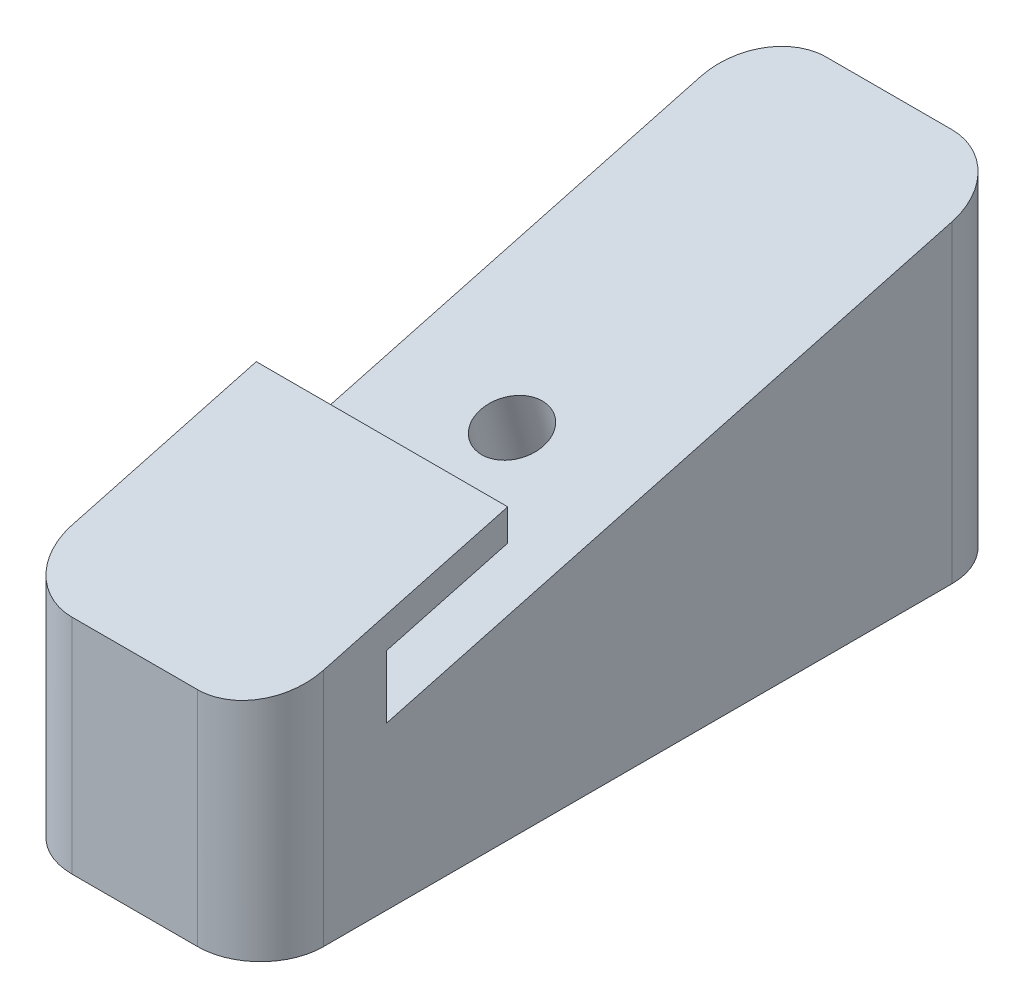
ISO-10303-21;
HEADER;
FILE_DESCRIPTION(('STEP AP214'),'2;1');
FILE_NAME('part.step','',(''),(''),'','','');
FILE_SCHEMA(('AUTOMOTIVE_DESIGN { 1 0 10303 214 1 1 1 1 }'));
ENDSEC;
DATA;
#1=APPLICATION_CONTEXT('core data for automotive mechanical design processes');
#2=APPLICATION_PROTOCOL_DEFINITION('international standard','automotive_design',2000,#1);
#3=PRODUCT_CONTEXT('',#1,'mechanical');
#4=PRODUCT('Part','Part','',(#3));
#5=PRODUCT_RELATED_PRODUCT_CATEGORY('part','',(#4));
#6=PRODUCT_DEFINITION_FORMATION('','',#4);
#7=PRODUCT_DEFINITION_CONTEXT('part definition',#1,'design');
#8=PRODUCT_DEFINITION('design','',#6,#7);
#9=PRODUCT_DEFINITION_SHAPE('','',#8);
#10=(LENGTH_UNIT() NAMED_UNIT(*) SI_UNIT(.MILLI.,.METRE.));
#11=(NAMED_UNIT(*) PLANE_ANGLE_UNIT() SI_UNIT($,.RADIAN.));
#12=(NAMED_UNIT(*) SI_UNIT($,.STERADIAN.) SOLID_ANGLE_UNIT());
#13=UNCERTAINTY_MEASURE_WITH_UNIT(LENGTH_MEASURE(1.E-05),#10,'distance_accuracy_value','');
#14=(GEOMETRIC_REPRESENTATION_CONTEXT(3) GLOBAL_UNCERTAINTY_ASSIGNED_CONTEXT((#13)) GLOBAL_UNIT_ASSIGNED_CONTEXT((#10,
#11,#12)) REPRESENTATION_CONTEXT('',''));
#15=CARTESIAN_POINT('',(0.,0.,0.));
#16=DIRECTION('',(0.,0.,1.));
#17=DIRECTION('',(1.,0.,0.));
#18=AXIS2_PLACEMENT_3D('',#15,#16,#17);
#19=CARTESIAN_POINT('',(-12.7,25.8858262806237,25.4));
#20=DIRECTION('',(0.,0.,-1.));
#21=DIRECTION('',(-1.,0.,0.));
#22=AXIS2_PLACEMENT_3D('',#19,#20,#21);
#23=PLANE('',#22);
#24=DIRECTION('',(0.,-1.,0.));
#25=VECTOR('',#24,1.);
#26=CARTESIAN_POINT('',(-12.7,25.8858262806237,25.4));
#27=LINE('',#26,#25);
#28=CARTESIAN_POINT('',(-12.7,22.7108262806237,25.4));
#29=VERTEX_POINT('',#28);
#30=CARTESIAN_POINT('',(-12.7,16.3608262806237,25.4));
#31=VERTEX_POINT('',#30);
#32=EDGE_CURVE('E162',#29,#31,#27,.T.);
#33=ORIENTED_EDGE('',*,*,#32,.F.);
#34=DIRECTION('',(-1.,0.,0.));
#35=VECTOR('',#34,1.);
#36=CARTESIAN_POINT('',(12.7,22.7108262806237,25.4));
#37=LINE('',#36,#35);
#38=CARTESIAN_POINT('',(12.7,22.7108262806237,25.4));
#39=VERTEX_POINT('',#38);
#40=EDGE_CURVE('E143',#39,#29,#37,.T.);
#41=ORIENTED_EDGE('',*,*,#40,.F.);
#42=DIRECTION('',(0.,-1.,0.));
#43=VECTOR('',#42,1.);
#44=CARTESIAN_POINT('',(12.7,25.8858262806237,25.4));
#45=LINE('',#44,#43);
#46=CARTESIAN_POINT('',(12.7,16.3608262806237,25.4));
#47=VERTEX_POINT('',#46);
#48=EDGE_CURVE('E149',#39,#47,#45,.T.);
#49=ORIENTED_EDGE('',*,*,#48,.T.);
#50=DIRECTION('',(1.,0.,0.));
#51=VECTOR('',#50,1.);
#52=CARTESIAN_POINT('',(-12.7,16.3608262806237,25.4));
#53=LINE('',#52,#51);
#54=EDGE_CURVE('E150',#31,#47,#53,.T.);
#55=ORIENTED_EDGE('',*,*,#54,.F.);
#56=EDGE_LOOP('',(#33,#41,#49,#55));
#57=FACE_BOUND('',#56,.T.);
#58=ADVANCED_FACE('F33',(#57),#23,.T.);
#59=CARTESIAN_POINT('',(0.,33.3756,38.1));
#60=DIRECTION('',(0.,0.,-1.));
#61=DIRECTION('',(-1.,0.,0.));
#62=AXIS2_PLACEMENT_3D('',#59,#60,#61);
#63=PLANE('',#62);
#64=DIRECTION('',(1.,0.,0.));
#65=VECTOR('',#64,1.);
#66=CARTESIAN_POINT('',(-12.7,22.4828715367484,38.1));
#67=LINE('',#66,#65);
#68=CARTESIAN_POINT('',(-6.35,22.4828715367484,38.1));
#69=VERTEX_POINT('',#68);
#70=CARTESIAN_POINT('',(6.35,22.4828715367484,38.1));
#71=VERTEX_POINT('',#70);
#72=EDGE_CURVE('E161',#69,#71,#67,.T.);
#73=ORIENTED_EDGE('',*,*,#72,.F.);
#74=DIRECTION('',(0.,-1.,0.));
#75=VECTOR('',#74,1.);
#76=CARTESIAN_POINT('',(-6.35,0.,38.1));
#77=LINE('',#76,#75);
#78=CARTESIAN_POINT('',(-6.35,0.,38.1));
#79=VERTEX_POINT('',#78);
#80=EDGE_CURVE('E190',#69,#79,#77,.T.);
#81=ORIENTED_EDGE('',*,*,#80,.T.);
#82=DIRECTION('',(1.,0.,0.));
#83=VECTOR('',#82,1.);
#84=CARTESIAN_POINT('',(0.,0.,38.1));
#85=LINE('',#84,#83);
#86=CARTESIAN_POINT('',(6.35,0.,38.1));
#87=VERTEX_POINT('',#86);
#88=EDGE_CURVE('E178',#79,#87,#85,.T.);
#89=ORIENTED_EDGE('',*,*,#88,.T.);
#90=DIRECTION('',(0.,-1.,0.));
#91=VECTOR('',#90,1.);
#92=CARTESIAN_POINT('',(6.35,33.3756,38.1));
#93=LINE('',#92,#91);
#94=EDGE_CURVE('E56',#87,#71,#93,.F.);
#95=ORIENTED_EDGE('',*,*,#94,.T.);
#96=EDGE_LOOP('',(#73,#81,#89,#95));
#97=FACE_BOUND('',#96,.T.);
#98=ADVANCED_FACE('F244',(#97),#63,.F.);
#99=CARTESIAN_POINT('',(12.7,33.3756,0.));
#100=DIRECTION('',(-1.,0.,0.));
#101=DIRECTION('',(0.,0.,1.));
#102=AXIS2_PLACEMENT_3D('',#99,#100,#101);
#103=PLANE('',#102);
#104=DIRECTION('',(0.,0.,-1.));
#105=VECTOR('',#104,1.);
#106=CARTESIAN_POINT('',(12.7,0.,0.));
#107=LINE('',#106,#105);
#108=CARTESIAN_POINT('',(12.7,0.,31.75));
#109=VERTEX_POINT('',#108);
#110=CARTESIAN_POINT('',(12.7,0.,-31.75));
#111=VERTEX_POINT('',#110);
#112=EDGE_CURVE('E198',#109,#111,#107,.T.);
#113=ORIENTED_EDGE('',*,*,#112,.T.);
#114=DIRECTION('',(0.,-1.,0.));
#115=VECTOR('',#114,1.);
#116=CARTESIAN_POINT('',(12.7,33.3756,-31.75));
#117=LINE('',#116,#115);
#118=CARTESIAN_POINT('',(12.7,31.6741226280624,-31.75));
#119=VERTEX_POINT('',#118);
#120=EDGE_CURVE('E11',#111,#119,#117,.F.);
#121=ORIENTED_EDGE('',*,*,#120,.T.);
#122=DIRECTION('',(0.,-0.258819045102522,0.965925826289068));
#123=VECTOR('',#122,1.);
#124=CARTESIAN_POINT('',(12.7,23.8506,-2.55221605790646));
#125=LINE('',#124,#123);
#126=EDGE_CURVE('E175',#119,#47,#125,.T.);
#127=ORIENTED_EDGE('',*,*,#126,.T.);
#128=ORIENTED_EDGE('',*,*,#48,.F.);
#129=DIRECTION('',(0.,-0.258819045102522,0.965925826289068));
#130=VECTOR('',#129,1.);
#131=CARTESIAN_POINT('',(12.7,25.9978281534257,13.1327420061288));
#132=LINE('',#131,#130);
#133=CARTESIAN_POINT('',(12.7,25.9978281534257,13.1327420061288));
#134=VERTEX_POINT('',#133);
#135=EDGE_CURVE('E128',#134,#39,#132,.T.);
#136=ORIENTED_EDGE('',*,*,#135,.F.);
#137=DIRECTION('',(0.,-1.,0.));
#138=VECTOR('',#137,1.);
#139=CARTESIAN_POINT('',(12.7,29.1728281534257,13.1327420061288));
#140=LINE('',#139,#138);
#141=CARTESIAN_POINT('',(12.7,29.1728281534257,13.1327420061288));
#142=VERTEX_POINT('',#141);
#143=EDGE_CURVE('E135',#142,#134,#140,.T.);
#144=ORIENTED_EDGE('',*,*,#143,.F.);
#145=DIRECTION('',(0.,0.258819045102522,-0.965925826289068));
#146=VECTOR('',#145,1.);
#147=CARTESIAN_POINT('',(12.7,22.4828715367484,38.1));
#148=LINE('',#147,#146);
#149=CARTESIAN_POINT('',(12.7,24.184348908686,31.75));
#150=VERTEX_POINT('',#149);
#151=EDGE_CURVE('E159',#150,#142,#148,.T.);
#152=ORIENTED_EDGE('',*,*,#151,.F.);
#153=DIRECTION('',(0.,-1.,0.));
#154=VECTOR('',#153,1.);
#155=CARTESIAN_POINT('',(12.7,33.3756,31.75));
#156=LINE('',#155,#154);
#157=EDGE_CURVE('E41',#150,#109,#156,.T.);
#158=ORIENTED_EDGE('',*,*,#157,.T.);
#159=EDGE_LOOP('',(#113,#121,#127,#128,#136,#144,#152,#158));
#160=FACE_BOUND('',#159,.T.);
#161=ADVANCED_FACE('F147',(#160),#103,.F.);
#162=CARTESIAN_POINT('',(0.,33.3756,-38.1));
#163=DIRECTION('',(0.,0.,-1.));
#164=DIRECTION('',(-1.,0.,0.));
#165=AXIS2_PLACEMENT_3D('',#162,#163,#164);
#166=PLANE('',#165);
#167=DIRECTION('',(1.,0.,0.));
#168=VECTOR('',#167,1.);
#169=CARTESIAN_POINT('',(0.,0.,-38.1));
#170=LINE('',#169,#168);
#171=CARTESIAN_POINT('',(-6.35,0.,-38.1));
#172=VERTEX_POINT('',#171);
#173=CARTESIAN_POINT('',(6.35,0.,-38.1));
#174=VERTEX_POINT('',#173);
#175=EDGE_CURVE('E208',#172,#174,#170,.T.);
#176=ORIENTED_EDGE('',*,*,#175,.F.);
#177=DIRECTION('',(0.,-1.,0.));
#178=VECTOR('',#177,1.);
#179=CARTESIAN_POINT('',(-6.35,33.3756,-38.1));
#180=LINE('',#179,#178);
#181=CARTESIAN_POINT('',(-6.35,33.3756,-38.1));
#182=VERTEX_POINT('',#181);
#183=EDGE_CURVE('E183',#172,#182,#180,.F.);
#184=ORIENTED_EDGE('',*,*,#183,.T.);
#185=DIRECTION('',(1.,0.,0.));
#186=VECTOR('',#185,1.);
#187=CARTESIAN_POINT('',(0.,33.3756,-38.1));
#188=LINE('',#187,#186);
#189=CARTESIAN_POINT('',(6.35,33.3756,-38.1));
#190=VERTEX_POINT('',#189);
#191=EDGE_CURVE('E213',#182,#190,#188,.T.);
#192=ORIENTED_EDGE('',*,*,#191,.T.);
#193=DIRECTION('',(0.,-1.,0.));
#194=VECTOR('',#193,1.);
#195=CARTESIAN_POINT('',(6.35,0.,-38.1));
#196=LINE('',#195,#194);
#197=EDGE_CURVE('E223',#190,#174,#196,.T.);
#198=ORIENTED_EDGE('',*,*,#197,.T.);
#199=EDGE_LOOP('',(#176,#184,#192,#198));
#200=FACE_BOUND('',#199,.T.);
#201=ADVANCED_FACE('F278',(#200),#166,.T.);
#202=CARTESIAN_POINT('',(-12.7,33.3756,0.));
#203=DIRECTION('',(-1.,0.,0.));
#204=DIRECTION('',(0.,0.,1.));
#205=AXIS2_PLACEMENT_3D('',#202,#203,#204);
#206=PLANE('',#205);
#207=DIRECTION('',(0.,0.258819045102522,-0.965925826289068));
#208=VECTOR('',#207,1.);
#209=CARTESIAN_POINT('',(-12.7,12.9578715367484,38.1));
#210=LINE('',#209,#208);
#211=CARTESIAN_POINT('',(-12.7,31.6741226280624,-31.75));
#212=VERTEX_POINT('',#211);
#213=EDGE_CURVE('E170',#31,#212,#210,.T.);
#214=ORIENTED_EDGE('',*,*,#213,.T.);
#215=DIRECTION('',(0.,-1.,0.));
#216=VECTOR('',#215,1.);
#217=CARTESIAN_POINT('',(-12.7,33.3756,-31.75));
#218=LINE('',#217,#216);
#219=CARTESIAN_POINT('',(-12.7,0.,-31.75));
#220=VERTEX_POINT('',#219);
#221=EDGE_CURVE('E232',#212,#220,#218,.T.);
#222=ORIENTED_EDGE('',*,*,#221,.T.);
#223=DIRECTION('',(0.,0.,-1.));
#224=VECTOR('',#223,1.);
#225=CARTESIAN_POINT('',(-12.7,0.,0.));
#226=LINE('',#225,#224);
#227=CARTESIAN_POINT('',(-12.7,0.,31.75));
#228=VERTEX_POINT('',#227);
#229=EDGE_CURVE('E209',#228,#220,#226,.T.);
#230=ORIENTED_EDGE('',*,*,#229,.F.);
#231=DIRECTION('',(0.,-1.,0.));
#232=VECTOR('',#231,1.);
#233=CARTESIAN_POINT('',(-12.7,22.4828715367484,31.75));
#234=LINE('',#233,#232);
#235=CARTESIAN_POINT('',(-12.7,24.184348908686,31.75));
#236=VERTEX_POINT('',#235);
#237=EDGE_CURVE('E216',#228,#236,#234,.F.);
#238=ORIENTED_EDGE('',*,*,#237,.T.);
#239=DIRECTION('',(0.,0.258819045102522,-0.965925826289068));
#240=VECTOR('',#239,1.);
#241=CARTESIAN_POINT('',(-12.7,22.4828715367484,38.1));
#242=LINE('',#241,#240);
#243=CARTESIAN_POINT('',(-12.7,29.1728281534257,13.1327420061288));
#244=VERTEX_POINT('',#243);
#245=EDGE_CURVE('E153',#236,#244,#242,.T.);
#246=ORIENTED_EDGE('',*,*,#245,.T.);
#247=DIRECTION('',(0.,1.,0.));
#248=VECTOR('',#247,1.);
#249=CARTESIAN_POINT('',(-12.7,29.1728281534257,13.1327420061288));
#250=LINE('',#249,#248);
#251=CARTESIAN_POINT('',(-12.7,25.9978281534257,13.1327420061288));
#252=VERTEX_POINT('',#251);
#253=EDGE_CURVE('E134',#252,#244,#250,.T.);
#254=ORIENTED_EDGE('',*,*,#253,.F.);
#255=DIRECTION('',(0.,-0.258819045102522,0.965925826289068));
#256=VECTOR('',#255,1.);
#257=CARTESIAN_POINT('',(-12.7,25.9978281534257,13.1327420061288));
#258=LINE('',#257,#256);
#259=EDGE_CURVE('E130',#252,#29,#258,.T.);
#260=ORIENTED_EDGE('',*,*,#259,.T.);
#261=ORIENTED_EDGE('',*,*,#32,.T.);
#262=EDGE_LOOP('',(#214,#222,#230,#238,#246,#254,#260,#261));
#263=FACE_BOUND('',#262,.T.);
#264=ADVANCED_FACE('F238',(#263),#206,.T.);
#265=CARTESIAN_POINT('',(0.,0.,0.));
#266=DIRECTION('',(0.,1.,0.));
#267=DIRECTION('',(0.,0.,1.));
#268=AXIS2_PLACEMENT_3D('',#265,#266,#267);
#269=PLANE('',#268);
#270=ORIENTED_EDGE('',*,*,#229,.T.);
#271=CARTESIAN_POINT('',(-6.35,0.,-31.75));
#272=DIRECTION('',(0.,1.,0.));
#273=DIRECTION('',(0.,0.,1.));
#274=AXIS2_PLACEMENT_3D('',#271,#272,#273);
#275=CIRCLE('',#274,6.35);
#276=EDGE_CURVE('E221',#220,#172,#275,.F.);
#277=ORIENTED_EDGE('',*,*,#276,.T.);
#278=ORIENTED_EDGE('',*,*,#175,.T.);
#279=CARTESIAN_POINT('',(6.35,0.,-31.75));
#280=DIRECTION('',(0.,1.,0.));
#281=DIRECTION('',(0.,0.,1.));
#282=AXIS2_PLACEMENT_3D('',#279,#280,#281);
#283=CIRCLE('',#282,6.35);
#284=EDGE_CURVE('E207',#174,#111,#283,.F.);
#285=ORIENTED_EDGE('',*,*,#284,.T.);
#286=ORIENTED_EDGE('',*,*,#112,.F.);
#287=CARTESIAN_POINT('',(6.35,0.,31.75));
#288=DIRECTION('',(0.,1.,0.));
#289=DIRECTION('',(0.,0.,1.));
#290=AXIS2_PLACEMENT_3D('',#287,#288,#289);
#291=CIRCLE('',#290,6.35);
#292=EDGE_CURVE('E205',#109,#87,#291,.F.);
#293=ORIENTED_EDGE('',*,*,#292,.T.);
#294=ORIENTED_EDGE('',*,*,#88,.F.);
#295=CARTESIAN_POINT('',(-6.35,0.,31.75));
#296=DIRECTION('',(0.,1.,0.));
#297=DIRECTION('',(0.,0.,1.));
#298=AXIS2_PLACEMENT_3D('',#295,#296,#297);
#299=CIRCLE('',#298,6.35);
#300=EDGE_CURVE('E228',#79,#228,#299,.F.);
#301=ORIENTED_EDGE('',*,*,#300,.T.);
#302=EDGE_LOOP('',(#270,#277,#278,#285,#286,#293,#294,#301));
#303=FACE_BOUND('',#302,.T.);
#304=ADVANCED_FACE('F203',(#303),#269,.F.);
#305=CARTESIAN_POINT('',(-12.7,12.9578715367484,38.1));
#306=DIRECTION('',(0.,-0.965925826289068,-0.258819045102522));
#307=DIRECTION('',(0.,0.258819045102522,-0.965925826289068));
#308=AXIS2_PLACEMENT_3D('',#305,#306,#307);
#309=PLANE('',#308);
#310=CARTESIAN_POINT('',(0.,23.1667357683742,0.));
#311=DIRECTION('',(0.,0.965925826289068,0.258819045102522));
#312=DIRECTION('',(0.,-0.258819045102522,0.965925826289068));
#313=AXIS2_PLACEMENT_3D('',#310,#311,#312);
#314=CIRCLE('',#313,3.175);
#315=CARTESIAN_POINT('',(0.,22.3449853001737,3.0668144984678));
#316=VERTEX_POINT('',#315);
#317=EDGE_CURVE('E165',#316,#316,#314,.T.);
#318=ORIENTED_EDGE('',*,*,#317,.F.);
#319=EDGE_LOOP('',(#318));
#320=FACE_BOUND('',#319,.T.);
#321=ORIENTED_EDGE('',*,*,#191,.F.);
#322=CARTESIAN_POINT('',(-6.35,31.6741226280624,-31.75));
#323=DIRECTION('',(0.,-0.965925826289068,-0.258819045102522));
#324=DIRECTION('',(0.,-0.258819045102522,0.965925826289068));
#325=AXIS2_PLACEMENT_3D('',#322,#323,#324);
#326=ELLIPSE('',#325,6.57400374560403,6.35);
#327=EDGE_CURVE('E187',#182,#212,#326,.F.);
#328=ORIENTED_EDGE('',*,*,#327,.T.);
#329=ORIENTED_EDGE('',*,*,#213,.F.);
#330=ORIENTED_EDGE('',*,*,#54,.T.);
#331=ORIENTED_EDGE('',*,*,#126,.F.);
#332=CARTESIAN_POINT('',(6.35,31.6741226280624,-31.75));
#333=DIRECTION('',(0.,-0.965925826289068,-0.258819045102522));
#334=DIRECTION('',(0.,0.258819045102522,-0.965925826289068));
#335=AXIS2_PLACEMENT_3D('',#332,#333,#334);
#336=ELLIPSE('',#335,6.57400374560403,6.35);
#337=EDGE_CURVE('E185',#119,#190,#336,.F.);
#338=ORIENTED_EDGE('',*,*,#337,.T.);
#339=EDGE_LOOP('',(#321,#328,#329,#330,#331,#338));
#340=FACE_BOUND('',#339,.T.);
#341=ADVANCED_FACE('F269',(#320,#340),#309,.F.);
#342=CARTESIAN_POINT('',(0.,17.0331067714386,-1.643500936401));
#343=DIRECTION('',(0.,0.965925826289068,0.258819045102522));
#344=DIRECTION('',(0.,-0.258819045102522,0.965925826289068));
#345=AXIS2_PLACEMENT_3D('',#342,#343,#344);
#346=CYLINDRICAL_SURFACE('',#345,3.175);
#347=CARTESIAN_POINT('',(0.,17.0331067714386,-1.643500936401));
#348=DIRECTION('',(0.,0.965925826289068,0.258819045102522));
#349=DIRECTION('',(0.,-0.258819045102522,0.965925826289068));
#350=AXIS2_PLACEMENT_3D('',#347,#348,#349);
#351=CIRCLE('',#350,3.175);
#352=CARTESIAN_POINT('',(0.,16.2113563032381,1.42331356206679));
#353=VERTEX_POINT('',#352);
#354=EDGE_CURVE('E167',#353,#353,#351,.T.);
#355=ORIENTED_EDGE('',*,*,#354,.F.);
#356=EDGE_LOOP('',(#355));
#357=FACE_BOUND('',#356,.T.);
#358=ORIENTED_EDGE('',*,*,#317,.T.);
#359=EDGE_LOOP('',(#358));
#360=FACE_BOUND('',#359,.T.);
#361=ADVANCED_FACE('F265',(#357,#360),#346,.F.);
#362=CARTESIAN_POINT('',(0.,17.0331067714386,-1.643500936401));
#363=DIRECTION('',(0.,0.965925826289068,0.258819045102522));
#364=DIRECTION('',(0.,-0.258819045102522,0.965925826289068));
#365=AXIS2_PLACEMENT_3D('',#362,#363,#364);
#366=PLANE('',#365);
#367=ORIENTED_EDGE('',*,*,#354,.T.);
#368=EDGE_LOOP('',(#367));
#369=FACE_BOUND('',#368,.T.);
#370=ADVANCED_FACE('F262',(#369),#366,.T.);
#371=CARTESIAN_POINT('',(0.,31.1398587332739,5.79168394209356));
#372=DIRECTION('',(0.,-0.965925826289068,-0.258819045102522));
#373=DIRECTION('',(0.,0.258819045102522,-0.965925826289068));
#374=AXIS2_PLACEMENT_3D('',#371,#372,#373);
#375=PLANE('',#374);
#376=ORIENTED_EDGE('',*,*,#245,.F.);
#377=CARTESIAN_POINT('',(-6.35,24.184348908686,31.75));
#378=DIRECTION('',(0.,-0.965925826289068,-0.258819045102522));
#379=DIRECTION('',(0.,0.258819045102522,-0.965925826289068));
#380=AXIS2_PLACEMENT_3D('',#377,#378,#379);
#381=ELLIPSE('',#380,6.57400374560403,6.35);
#382=EDGE_CURVE('E194',#236,#69,#381,.F.);
#383=ORIENTED_EDGE('',*,*,#382,.T.);
#384=ORIENTED_EDGE('',*,*,#72,.T.);
#385=CARTESIAN_POINT('',(6.35,24.184348908686,31.75));
#386=DIRECTION('',(0.,-0.965925826289068,-0.258819045102522));
#387=DIRECTION('',(0.,-0.258819045102522,0.965925826289068));
#388=AXIS2_PLACEMENT_3D('',#385,#386,#387);
#389=ELLIPSE('',#388,6.57400374560403,6.35);
#390=EDGE_CURVE('E48',#71,#150,#389,.F.);
#391=ORIENTED_EDGE('',*,*,#390,.T.);
#392=ORIENTED_EDGE('',*,*,#151,.T.);
#393=DIRECTION('',(1.,0.,0.));
#394=VECTOR('',#393,1.);
#395=CARTESIAN_POINT('',(12.7,29.1728281534257,13.1327420061288));
#396=LINE('',#395,#394);
#397=EDGE_CURVE('E141',#244,#142,#396,.T.);
#398=ORIENTED_EDGE('',*,*,#397,.F.);
#399=EDGE_LOOP('',(#376,#383,#384,#391,#392,#398));
#400=FACE_BOUND('',#399,.T.);
#401=ADVANCED_FACE('F241',(#400),#375,.F.);
#402=CARTESIAN_POINT('',(12.7,25.9978281534257,13.1327420061288));
#403=DIRECTION('',(0.,0.965925826289068,0.258819045102522));
#404=DIRECTION('',(0.,-0.258819045102522,0.965925826289068));
#405=AXIS2_PLACEMENT_3D('',#402,#403,#404);
#406=PLANE('',#405);
#407=ORIENTED_EDGE('',*,*,#40,.T.);
#408=ORIENTED_EDGE('',*,*,#259,.F.);
#409=DIRECTION('',(-1.,0.,0.));
#410=VECTOR('',#409,1.);
#411=CARTESIAN_POINT('',(12.7,25.9978281534257,13.1327420061288));
#412=LINE('',#411,#410);
#413=EDGE_CURVE('E123',#134,#252,#412,.T.);
#414=ORIENTED_EDGE('',*,*,#413,.F.);
#415=ORIENTED_EDGE('',*,*,#135,.T.);
#416=EDGE_LOOP('',(#407,#408,#414,#415));
#417=FACE_BOUND('',#416,.T.);
#418=ADVANCED_FACE('F126',(#417),#406,.F.);
#419=CARTESIAN_POINT('',(0.,3.28700187280203,13.1327420061288));
#420=DIRECTION('',(0.,0.,-1.));
#421=DIRECTION('',(-1.,0.,0.));
#422=AXIS2_PLACEMENT_3D('',#419,#420,#421);
#423=PLANE('',#422);
#424=ORIENTED_EDGE('',*,*,#143,.T.);
#425=ORIENTED_EDGE('',*,*,#413,.T.);
#426=ORIENTED_EDGE('',*,*,#253,.T.);
#427=ORIENTED_EDGE('',*,*,#397,.T.);
#428=EDGE_LOOP('',(#424,#425,#426,#427));
#429=FACE_BOUND('',#428,.T.);
#430=ADVANCED_FACE('F139',(#429),#423,.T.);
#431=CARTESIAN_POINT('',(-6.35,33.3756,-31.75));
#432=DIRECTION('',(0.,-1.,0.));
#433=DIRECTION('',(0.,0.,-1.));
#434=AXIS2_PLACEMENT_3D('',#431,#432,#433);
#435=CYLINDRICAL_SURFACE('',#434,6.35);
#436=ORIENTED_EDGE('',*,*,#327,.F.);
#437=ORIENTED_EDGE('',*,*,#183,.F.);
#438=ORIENTED_EDGE('',*,*,#276,.F.);
#439=ORIENTED_EDGE('',*,*,#221,.F.);
#440=EDGE_LOOP('',(#436,#437,#438,#439));
#441=FACE_BOUND('',#440,.T.);
#442=ADVANCED_FACE('F283',(#441),#435,.T.);
#443=CARTESIAN_POINT('',(-6.35,33.3756,31.75));
#444=DIRECTION('',(0.,1.,0.));
#445=DIRECTION('',(0.,0.,1.));
#446=AXIS2_PLACEMENT_3D('',#443,#444,#445);
#447=CYLINDRICAL_SURFACE('',#446,6.35);
#448=ORIENTED_EDGE('',*,*,#382,.F.);
#449=ORIENTED_EDGE('',*,*,#237,.F.);
#450=ORIENTED_EDGE('',*,*,#300,.F.);
#451=ORIENTED_EDGE('',*,*,#80,.F.);
#452=EDGE_LOOP('',(#448,#449,#450,#451));
#453=FACE_BOUND('',#452,.T.);
#454=ADVANCED_FACE('F243',(#453),#447,.T.);
#455=CARTESIAN_POINT('',(6.35,33.3756,-31.75));
#456=DIRECTION('',(0.,1.,0.));
#457=DIRECTION('',(0.,0.,1.));
#458=AXIS2_PLACEMENT_3D('',#455,#456,#457);
#459=CYLINDRICAL_SURFACE('',#458,6.35);
#460=ORIENTED_EDGE('',*,*,#337,.F.);
#461=ORIENTED_EDGE('',*,*,#120,.F.);
#462=ORIENTED_EDGE('',*,*,#284,.F.);
#463=ORIENTED_EDGE('',*,*,#197,.F.);
#464=EDGE_LOOP('',(#460,#461,#462,#463));
#465=FACE_BOUND('',#464,.T.);
#466=ADVANCED_FACE('F246',(#465),#459,.T.);
#467=CARTESIAN_POINT('',(6.35,33.3756,31.75));
#468=DIRECTION('',(0.,-1.,0.));
#469=DIRECTION('',(0.,0.,-1.));
#470=AXIS2_PLACEMENT_3D('',#467,#468,#469);
#471=CYLINDRICAL_SURFACE('',#470,6.35);
#472=ORIENTED_EDGE('',*,*,#390,.F.);
#473=ORIENTED_EDGE('',*,*,#94,.F.);
#474=ORIENTED_EDGE('',*,*,#292,.F.);
#475=ORIENTED_EDGE('',*,*,#157,.F.);
#476=EDGE_LOOP('',(#472,#473,#474,#475));
#477=FACE_BOUND('',#476,.T.);
#478=ADVANCED_FACE('F35',(#477),#471,.T.);
#479=CLOSED_SHELL('',(#58,#98,#161,#201,#264,#304,#341,#361,#370,#401,#418,#430,#442,#454,#466,#478));
#480=MANIFOLD_SOLID_BREP('B2',#479);
#481=ADVANCED_BREP_SHAPE_REPRESENTATION('',(#18,#480),#14);
#482=SHAPE_DEFINITION_REPRESENTATION(#9,#481);
ENDSEC;
END-ISO-10303-21;
